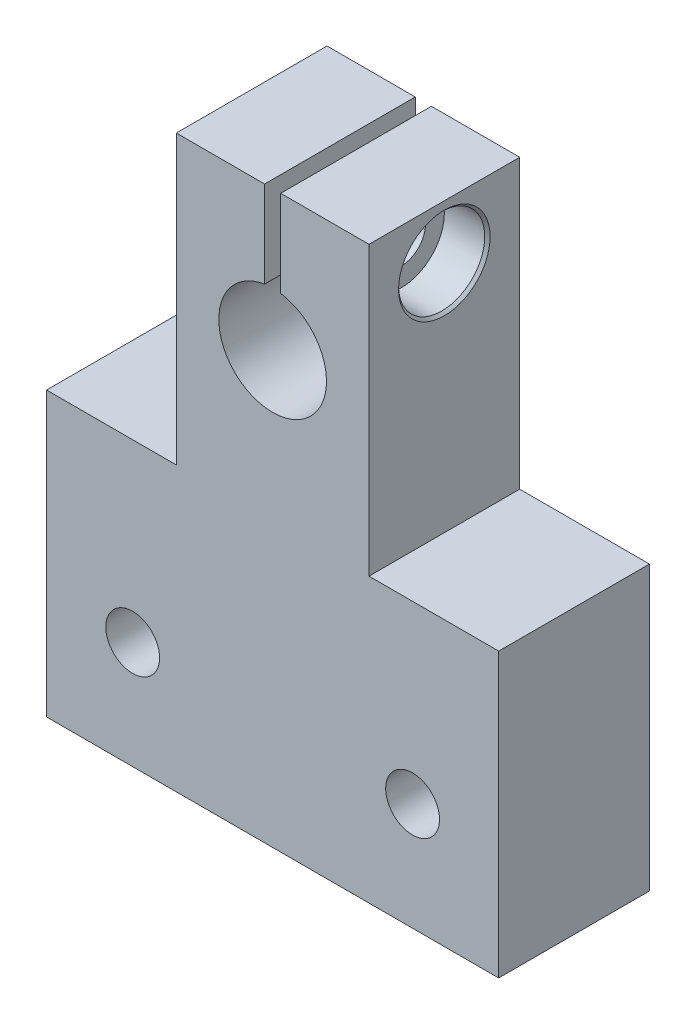
ISO-10303-21;
HEADER;
FILE_DESCRIPTION(('STEP AP214'),'2;1');
FILE_NAME('part.step','',(''),(''),'','','');
FILE_SCHEMA(('AUTOMOTIVE_DESIGN { 1 0 10303 214 1 1 1 1 }'));
ENDSEC;
DATA;
#1=APPLICATION_CONTEXT('core data for automotive mechanical design processes');
#2=APPLICATION_PROTOCOL_DEFINITION('international standard','automotive_design',2000,#1);
#3=PRODUCT_CONTEXT('',#1,'mechanical');
#4=PRODUCT('Part','Part','',(#3));
#5=PRODUCT_RELATED_PRODUCT_CATEGORY('part','',(#4));
#6=PRODUCT_DEFINITION_FORMATION('','',#4);
#7=PRODUCT_DEFINITION_CONTEXT('part definition',#1,'design');
#8=PRODUCT_DEFINITION('design','',#6,#7);
#9=PRODUCT_DEFINITION_SHAPE('','',#8);
#10=(LENGTH_UNIT() NAMED_UNIT(*) SI_UNIT(.MILLI.,.METRE.));
#11=(NAMED_UNIT(*) PLANE_ANGLE_UNIT() SI_UNIT($,.RADIAN.));
#12=(NAMED_UNIT(*) SI_UNIT($,.STERADIAN.) SOLID_ANGLE_UNIT());
#13=UNCERTAINTY_MEASURE_WITH_UNIT(LENGTH_MEASURE(1.E-05),#10,'distance_accuracy_value','');
#14=(GEOMETRIC_REPRESENTATION_CONTEXT(3) GLOBAL_UNCERTAINTY_ASSIGNED_CONTEXT((#13)) GLOBAL_UNIT_ASSIGNED_CONTEXT((#10,
#11,#12)) REPRESENTATION_CONTEXT('',''));
#15=CARTESIAN_POINT('',(0.,0.,0.));
#16=DIRECTION('',(0.,0.,1.));
#17=DIRECTION('',(1.,0.,0.));
#18=AXIS2_PLACEMENT_3D('',#15,#16,#17);
#19=CARTESIAN_POINT('',(-21.,6.3,7.));
#20=DIRECTION('',(1.,0.,0.));
#21=DIRECTION('',(0.,0.,-1.));
#22=AXIS2_PLACEMENT_3D('',#19,#20,#21);
#23=PLANE('',#22);
#24=DIRECTION('',(0.,-1.,0.));
#25=VECTOR('',#24,1.);
#26=CARTESIAN_POINT('',(-21.,6.3,-7.));
#27=LINE('',#26,#25);
#28=CARTESIAN_POINT('',(-21.,6.3,-7.));
#29=VERTEX_POINT('',#28);
#30=CARTESIAN_POINT('',(-21.,-20.,-7.));
#31=VERTEX_POINT('',#30);
#32=EDGE_CURVE('E151',#29,#31,#27,.T.);
#33=ORIENTED_EDGE('',*,*,#32,.T.);
#34=DIRECTION('',(0.,0.,-1.));
#35=VECTOR('',#34,1.);
#36=CARTESIAN_POINT('',(-21.,-20.,7.));
#37=LINE('',#36,#35);
#38=CARTESIAN_POINT('',(-21.,-20.,7.));
#39=VERTEX_POINT('',#38);
#40=EDGE_CURVE('E195',#39,#31,#37,.T.);
#41=ORIENTED_EDGE('',*,*,#40,.F.);
#42=DIRECTION('',(0.,-1.,0.));
#43=VECTOR('',#42,1.);
#44=CARTESIAN_POINT('',(-21.,6.3,7.));
#45=LINE('',#44,#43);
#46=CARTESIAN_POINT('',(-21.,6.3,7.));
#47=VERTEX_POINT('',#46);
#48=EDGE_CURVE('E172',#47,#39,#45,.T.);
#49=ORIENTED_EDGE('',*,*,#48,.F.);
#50=DIRECTION('',(0.,0.,-1.));
#51=VECTOR('',#50,1.);
#52=CARTESIAN_POINT('',(-21.,6.3,7.));
#53=LINE('',#52,#51);
#54=EDGE_CURVE('E147',#47,#29,#53,.T.);
#55=ORIENTED_EDGE('',*,*,#54,.T.);
#56=EDGE_LOOP('',(#33,#41,#49,#55));
#57=FACE_BOUND('',#56,.T.);
#58=ADVANCED_FACE('F37',(#57),#23,.F.);
#59=CARTESIAN_POINT('',(21.,6.3,7.));
#60=DIRECTION('',(-1.,0.,0.));
#61=DIRECTION('',(0.,0.,1.));
#62=AXIS2_PLACEMENT_3D('',#59,#60,#61);
#63=PLANE('',#62);
#64=DIRECTION('',(0.,1.,0.));
#65=VECTOR('',#64,1.);
#66=CARTESIAN_POINT('',(21.,6.3,-7.));
#67=LINE('',#66,#65);
#68=CARTESIAN_POINT('',(21.,-20.,-7.));
#69=VERTEX_POINT('',#68);
#70=CARTESIAN_POINT('',(21.,6.3,-7.));
#71=VERTEX_POINT('',#70);
#72=EDGE_CURVE('E154',#69,#71,#67,.T.);
#73=ORIENTED_EDGE('',*,*,#72,.T.);
#74=DIRECTION('',(0.,0.,-1.));
#75=VECTOR('',#74,1.);
#76=CARTESIAN_POINT('',(21.,6.3,7.));
#77=LINE('',#76,#75);
#78=CARTESIAN_POINT('',(21.,6.3,7.));
#79=VERTEX_POINT('',#78);
#80=EDGE_CURVE('E11',#79,#71,#77,.T.);
#81=ORIENTED_EDGE('',*,*,#80,.F.);
#82=DIRECTION('',(0.,1.,0.));
#83=VECTOR('',#82,1.);
#84=CARTESIAN_POINT('',(21.,6.3,7.));
#85=LINE('',#84,#83);
#86=CARTESIAN_POINT('',(21.,-20.,7.));
#87=VERTEX_POINT('',#86);
#88=EDGE_CURVE('E105',#87,#79,#85,.T.);
#89=ORIENTED_EDGE('',*,*,#88,.F.);
#90=DIRECTION('',(0.,0.,1.));
#91=VECTOR('',#90,1.);
#92=CARTESIAN_POINT('',(21.,-20.,-7.));
#93=LINE('',#92,#91);
#94=EDGE_CURVE('E209',#69,#87,#93,.T.);
#95=ORIENTED_EDGE('',*,*,#94,.F.);
#96=EDGE_LOOP('',(#73,#81,#89,#95));
#97=FACE_BOUND('',#96,.T.);
#98=ADVANCED_FACE('F273',(#97),#63,.F.);
#99=CARTESIAN_POINT('',(8.95,6.3,7.));
#100=DIRECTION('',(0.,-1.,0.));
#101=DIRECTION('',(0.,0.,-1.));
#102=AXIS2_PLACEMENT_3D('',#99,#100,#101);
#103=PLANE('',#102);
#104=DIRECTION('',(-1.,0.,0.));
#105=VECTOR('',#104,1.);
#106=CARTESIAN_POINT('',(8.95,6.3,-7.));
#107=LINE('',#106,#105);
#108=CARTESIAN_POINT('',(8.95,6.3,-7.));
#109=VERTEX_POINT('',#108);
#110=EDGE_CURVE('E157',#71,#109,#107,.T.);
#111=ORIENTED_EDGE('',*,*,#110,.T.);
#112=DIRECTION('',(0.,0.,-1.));
#113=VECTOR('',#112,1.);
#114=CARTESIAN_POINT('',(8.95,6.3,7.));
#115=LINE('',#114,#113);
#116=CARTESIAN_POINT('',(8.95,6.3,7.));
#117=VERTEX_POINT('',#116);
#118=EDGE_CURVE('E46',#117,#109,#115,.T.);
#119=ORIENTED_EDGE('',*,*,#118,.F.);
#120=DIRECTION('',(-1.,0.,0.));
#121=VECTOR('',#120,1.);
#122=CARTESIAN_POINT('',(8.95,6.3,7.));
#123=LINE('',#122,#121);
#124=EDGE_CURVE('E237',#79,#117,#123,.T.);
#125=ORIENTED_EDGE('',*,*,#124,.F.);
#126=ORIENTED_EDGE('',*,*,#80,.T.);
#127=EDGE_LOOP('',(#111,#119,#125,#126));
#128=FACE_BOUND('',#127,.T.);
#129=ADVANCED_FACE('F277',(#128),#103,.F.);
#130=CARTESIAN_POINT('',(8.95,33.,7.));
#131=DIRECTION('',(-1.,0.,0.));
#132=DIRECTION('',(0.,-1.,0.));
#133=AXIS2_PLACEMENT_3D('',#130,#131,#132);
#134=PLANE('',#133);
#135=CARTESIAN_POINT('',(8.95,28.,0.));
#136=DIRECTION('',(1.,0.,0.));
#137=DIRECTION('',(0.,0.,-1.));
#138=AXIS2_PLACEMENT_3D('',#135,#136,#137);
#139=CIRCLE('',#138,4.25);
#140=CARTESIAN_POINT('',(8.95,28.,-4.25));
#141=VERTEX_POINT('',#140);
#142=EDGE_CURVE('E221',#141,#141,#139,.T.);
#143=ORIENTED_EDGE('',*,*,#142,.F.);
#144=EDGE_LOOP('',(#143));
#145=FACE_BOUND('',#144,.T.);
#146=DIRECTION('',(0.,1.,0.));
#147=VECTOR('',#146,1.);
#148=CARTESIAN_POINT('',(8.95,33.,-7.));
#149=LINE('',#148,#147);
#150=CARTESIAN_POINT('',(8.95,33.,-7.));
#151=VERTEX_POINT('',#150);
#152=EDGE_CURVE('E159',#109,#151,#149,.T.);
#153=ORIENTED_EDGE('',*,*,#152,.T.);
#154=DIRECTION('',(0.,0.,-1.));
#155=VECTOR('',#154,1.);
#156=CARTESIAN_POINT('',(8.95,33.,7.));
#157=LINE('',#156,#155);
#158=CARTESIAN_POINT('',(8.95,33.,7.));
#159=VERTEX_POINT('',#158);
#160=EDGE_CURVE('E185',#159,#151,#157,.T.);
#161=ORIENTED_EDGE('',*,*,#160,.F.);
#162=DIRECTION('',(0.,1.,0.));
#163=VECTOR('',#162,1.);
#164=CARTESIAN_POINT('',(8.95,33.,7.));
#165=LINE('',#164,#163);
#166=EDGE_CURVE('E239',#117,#159,#165,.T.);
#167=ORIENTED_EDGE('',*,*,#166,.F.);
#168=ORIENTED_EDGE('',*,*,#118,.T.);
#169=EDGE_LOOP('',(#153,#161,#167,#168));
#170=FACE_BOUND('',#169,.T.);
#171=ADVANCED_FACE('F284',(#145,#170),#134,.F.);
#172=CARTESIAN_POINT('',(0.75,33.,7.));
#173=DIRECTION('',(0.,-1.,0.));
#174=DIRECTION('',(0.,0.,-1.));
#175=AXIS2_PLACEMENT_3D('',#172,#173,#174);
#176=PLANE('',#175);
#177=DIRECTION('',(-1.,0.,0.));
#178=VECTOR('',#177,1.);
#179=CARTESIAN_POINT('',(0.75,33.,-7.));
#180=LINE('',#179,#178);
#181=CARTESIAN_POINT('',(0.75,33.,-7.));
#182=VERTEX_POINT('',#181);
#183=EDGE_CURVE('E161',#151,#182,#180,.T.);
#184=ORIENTED_EDGE('',*,*,#183,.T.);
#185=DIRECTION('',(0.,0.,-1.));
#186=VECTOR('',#185,1.);
#187=CARTESIAN_POINT('',(0.75,33.,7.));
#188=LINE('',#187,#186);
#189=CARTESIAN_POINT('',(0.75,33.,7.));
#190=VERTEX_POINT('',#189);
#191=EDGE_CURVE('E182',#190,#182,#188,.T.);
#192=ORIENTED_EDGE('',*,*,#191,.F.);
#193=DIRECTION('',(-1.,0.,0.));
#194=VECTOR('',#193,1.);
#195=CARTESIAN_POINT('',(0.75,33.,7.));
#196=LINE('',#195,#194);
#197=EDGE_CURVE('E241',#159,#190,#196,.T.);
#198=ORIENTED_EDGE('',*,*,#197,.F.);
#199=ORIENTED_EDGE('',*,*,#160,.T.);
#200=EDGE_LOOP('',(#184,#192,#198,#199));
#201=FACE_BOUND('',#200,.T.);
#202=ADVANCED_FACE('F288',(#201),#176,.F.);
#203=CARTESIAN_POINT('',(0.75,33.,7.));
#204=DIRECTION('',(1.,0.,0.));
#205=DIRECTION('',(0.,1.,0.));
#206=AXIS2_PLACEMENT_3D('',#203,#204,#205);
#207=PLANE('',#206);
#208=CARTESIAN_POINT('',(0.750000000000001,28.,0.));
#209=DIRECTION('',(1.,0.,0.));
#210=DIRECTION('',(0.,1.,0.));
#211=AXIS2_PLACEMENT_3D('',#208,#209,#210);
#212=CIRCLE('',#211,2.25);
#213=CARTESIAN_POINT('',(0.75,30.25,0.));
#214=VERTEX_POINT('',#213);
#215=EDGE_CURVE('E155',#214,#214,#212,.T.);
#216=ORIENTED_EDGE('',*,*,#215,.T.);
#217=EDGE_LOOP('',(#216));
#218=FACE_BOUND('',#217,.T.);
#219=DIRECTION('',(0.,-1.,0.));
#220=VECTOR('',#219,1.);
#221=CARTESIAN_POINT('',(0.75,33.,-7.));
#222=LINE('',#221,#220);
#223=CARTESIAN_POINT('',(0.750000000000002,24.9434299833213,-7.));
#224=VERTEX_POINT('',#223);
#225=EDGE_CURVE('E163',#182,#224,#222,.T.);
#226=ORIENTED_EDGE('',*,*,#225,.T.);
#227=DIRECTION('',(0.,0.,-1.));
#228=VECTOR('',#227,1.);
#229=CARTESIAN_POINT('',(0.750000000000002,24.9434299833213,7.));
#230=LINE('',#229,#228);
#231=CARTESIAN_POINT('',(0.750000000000002,24.9434299833213,7.));
#232=VERTEX_POINT('',#231);
#233=EDGE_CURVE('E179',#232,#224,#230,.T.);
#234=ORIENTED_EDGE('',*,*,#233,.F.);
#235=DIRECTION('',(0.,-1.,0.));
#236=VECTOR('',#235,1.);
#237=CARTESIAN_POINT('',(0.75,33.,7.));
#238=LINE('',#237,#236);
#239=EDGE_CURVE('E243',#190,#232,#238,.T.);
#240=ORIENTED_EDGE('',*,*,#239,.F.);
#241=ORIENTED_EDGE('',*,*,#191,.T.);
#242=EDGE_LOOP('',(#226,#234,#240,#241));
#243=FACE_BOUND('',#242,.T.);
#244=ADVANCED_FACE('F291',(#218,#243),#207,.F.);
#245=CARTESIAN_POINT('',(0.,20.,7.));
#246=DIRECTION('',(0.,0.,-1.));
#247=DIRECTION('',(-1.,0.,0.));
#248=AXIS2_PLACEMENT_3D('',#245,#246,#247);
#249=CYLINDRICAL_SURFACE('',#248,5.);
#250=CARTESIAN_POINT('',(0.,20.,-7.));
#251=DIRECTION('',(0.,0.,-1.));
#252=DIRECTION('',(1.,0.,0.));
#253=AXIS2_PLACEMENT_3D('',#250,#251,#252);
#254=CIRCLE('',#253,5.);
#255=CARTESIAN_POINT('',(-0.750000000000001,24.9434299833213,-7.));
#256=VERTEX_POINT('',#255);
#257=EDGE_CURVE('E165',#224,#256,#254,.T.);
#258=ORIENTED_EDGE('',*,*,#257,.T.);
#259=DIRECTION('',(0.,0.,-1.));
#260=VECTOR('',#259,1.);
#261=CARTESIAN_POINT('',(-0.750000000000001,24.9434299833213,7.));
#262=LINE('',#261,#260);
#263=CARTESIAN_POINT('',(-0.750000000000001,24.9434299833213,7.));
#264=VERTEX_POINT('',#263);
#265=EDGE_CURVE('E176',#264,#256,#262,.T.);
#266=ORIENTED_EDGE('',*,*,#265,.F.);
#267=CARTESIAN_POINT('',(0.,20.,7.));
#268=DIRECTION('',(0.,0.,-1.));
#269=DIRECTION('',(1.,0.,0.));
#270=AXIS2_PLACEMENT_3D('',#267,#268,#269);
#271=CIRCLE('',#270,5.);
#272=EDGE_CURVE('E245',#232,#264,#271,.T.);
#273=ORIENTED_EDGE('',*,*,#272,.F.);
#274=ORIENTED_EDGE('',*,*,#233,.T.);
#275=EDGE_LOOP('',(#258,#266,#273,#274));
#276=FACE_BOUND('',#275,.T.);
#277=ADVANCED_FACE('F251',(#276),#249,.F.);
#278=CARTESIAN_POINT('',(-0.75,33.,7.));
#279=DIRECTION('',(-1.,0.,0.));
#280=DIRECTION('',(0.,-1.,0.));
#281=AXIS2_PLACEMENT_3D('',#278,#279,#280);
#282=PLANE('',#281);
#283=CARTESIAN_POINT('',(-0.75,28.,0.));
#284=DIRECTION('',(1.,0.,0.));
#285=DIRECTION('',(0.,0.,-1.));
#286=AXIS2_PLACEMENT_3D('',#283,#284,#285);
#287=CIRCLE('',#286,1.65);
#288=CARTESIAN_POINT('',(-0.75,28.,-1.65));
#289=VERTEX_POINT('',#288);
#290=EDGE_CURVE('E215',#289,#289,#287,.T.);
#291=ORIENTED_EDGE('',*,*,#290,.F.);
#292=EDGE_LOOP('',(#291));
#293=FACE_BOUND('',#292,.T.);
#294=DIRECTION('',(0.,1.,0.));
#295=VECTOR('',#294,1.);
#296=CARTESIAN_POINT('',(-0.75,33.,-7.));
#297=LINE('',#296,#295);
#298=CARTESIAN_POINT('',(-0.75,33.,-7.));
#299=VERTEX_POINT('',#298);
#300=EDGE_CURVE('E167',#256,#299,#297,.T.);
#301=ORIENTED_EDGE('',*,*,#300,.T.);
#302=DIRECTION('',(0.,0.,-1.));
#303=VECTOR('',#302,1.);
#304=CARTESIAN_POINT('',(-0.75,33.,7.));
#305=LINE('',#304,#303);
#306=CARTESIAN_POINT('',(-0.75,33.,7.));
#307=VERTEX_POINT('',#306);
#308=EDGE_CURVE('E142',#307,#299,#305,.T.);
#309=ORIENTED_EDGE('',*,*,#308,.F.);
#310=DIRECTION('',(0.,1.,0.));
#311=VECTOR('',#310,1.);
#312=CARTESIAN_POINT('',(-0.75,33.,7.));
#313=LINE('',#312,#311);
#314=EDGE_CURVE('E133',#264,#307,#313,.T.);
#315=ORIENTED_EDGE('',*,*,#314,.F.);
#316=ORIENTED_EDGE('',*,*,#265,.T.);
#317=EDGE_LOOP('',(#301,#309,#315,#316));
#318=FACE_BOUND('',#317,.T.);
#319=ADVANCED_FACE('F255',(#293,#318),#282,.F.);
#320=CARTESIAN_POINT('',(-8.95,33.,7.));
#321=DIRECTION('',(0.,-1.,0.));
#322=DIRECTION('',(0.,0.,-1.));
#323=AXIS2_PLACEMENT_3D('',#320,#321,#322);
#324=PLANE('',#323);
#325=DIRECTION('',(-1.,0.,0.));
#326=VECTOR('',#325,1.);
#327=CARTESIAN_POINT('',(-8.95,33.,-7.));
#328=LINE('',#327,#326);
#329=CARTESIAN_POINT('',(-8.95,33.,-7.));
#330=VERTEX_POINT('',#329);
#331=EDGE_CURVE('E141',#299,#330,#328,.T.);
#332=ORIENTED_EDGE('',*,*,#331,.T.);
#333=DIRECTION('',(0.,0.,-1.));
#334=VECTOR('',#333,1.);
#335=CARTESIAN_POINT('',(-8.95,33.,7.));
#336=LINE('',#335,#334);
#337=CARTESIAN_POINT('',(-8.95,33.,7.));
#338=VERTEX_POINT('',#337);
#339=EDGE_CURVE('E138',#338,#330,#336,.T.);
#340=ORIENTED_EDGE('',*,*,#339,.F.);
#341=DIRECTION('',(-1.,0.,0.));
#342=VECTOR('',#341,1.);
#343=CARTESIAN_POINT('',(-8.95,33.,7.));
#344=LINE('',#343,#342);
#345=EDGE_CURVE('E127',#307,#338,#344,.T.);
#346=ORIENTED_EDGE('',*,*,#345,.F.);
#347=ORIENTED_EDGE('',*,*,#308,.T.);
#348=EDGE_LOOP('',(#332,#340,#346,#347));
#349=FACE_BOUND('',#348,.T.);
#350=ADVANCED_FACE('F139',(#349),#324,.F.);
#351=CARTESIAN_POINT('',(-8.95,33.,7.));
#352=DIRECTION('',(1.,0.,0.));
#353=DIRECTION('',(0.,1.,0.));
#354=AXIS2_PLACEMENT_3D('',#351,#352,#353);
#355=PLANE('',#354);
#356=CARTESIAN_POINT('',(-8.95,28.,0.));
#357=DIRECTION('',(1.,0.,0.));
#358=DIRECTION('',(0.,1.,0.));
#359=AXIS2_PLACEMENT_3D('',#356,#357,#358);
#360=CIRCLE('',#359,1.65);
#361=CARTESIAN_POINT('',(-8.95,29.65,0.));
#362=VERTEX_POINT('',#361);
#363=EDGE_CURVE('E218',#362,#362,#360,.T.);
#364=ORIENTED_EDGE('',*,*,#363,.T.);
#365=EDGE_LOOP('',(#364));
#366=FACE_BOUND('',#365,.T.);
#367=DIRECTION('',(0.,-1.,0.));
#368=VECTOR('',#367,1.);
#369=CARTESIAN_POINT('',(-8.95,33.,-7.));
#370=LINE('',#369,#368);
#371=CARTESIAN_POINT('',(-8.95,6.3,-7.));
#372=VERTEX_POINT('',#371);
#373=EDGE_CURVE('E91',#330,#372,#370,.T.);
#374=ORIENTED_EDGE('',*,*,#373,.T.);
#375=DIRECTION('',(0.,0.,-1.));
#376=VECTOR('',#375,1.);
#377=CARTESIAN_POINT('',(-8.95,6.3,7.));
#378=LINE('',#377,#376);
#379=CARTESIAN_POINT('',(-8.95,6.3,7.));
#380=VERTEX_POINT('',#379);
#381=EDGE_CURVE('E143',#380,#372,#378,.T.);
#382=ORIENTED_EDGE('',*,*,#381,.F.);
#383=DIRECTION('',(0.,-1.,0.));
#384=VECTOR('',#383,1.);
#385=CARTESIAN_POINT('',(-8.95,33.,7.));
#386=LINE('',#385,#384);
#387=EDGE_CURVE('E131',#338,#380,#386,.T.);
#388=ORIENTED_EDGE('',*,*,#387,.F.);
#389=ORIENTED_EDGE('',*,*,#339,.T.);
#390=EDGE_LOOP('',(#374,#382,#388,#389));
#391=FACE_BOUND('',#390,.T.);
#392=ADVANCED_FACE('F145',(#366,#391),#355,.F.);
#393=CARTESIAN_POINT('',(-21.,6.3,7.));
#394=DIRECTION('',(0.,-1.,0.));
#395=DIRECTION('',(0.,0.,-1.));
#396=AXIS2_PLACEMENT_3D('',#393,#394,#395);
#397=PLANE('',#396);
#398=DIRECTION('',(-1.,0.,0.));
#399=VECTOR('',#398,1.);
#400=CARTESIAN_POINT('',(-21.,6.3,-7.));
#401=LINE('',#400,#399);
#402=EDGE_CURVE('E97',#372,#29,#401,.T.);
#403=ORIENTED_EDGE('',*,*,#402,.T.);
#404=ORIENTED_EDGE('',*,*,#54,.F.);
#405=DIRECTION('',(-1.,0.,0.));
#406=VECTOR('',#405,1.);
#407=CARTESIAN_POINT('',(-21.,6.3,7.));
#408=LINE('',#407,#406);
#409=EDGE_CURVE('E55',#380,#47,#408,.T.);
#410=ORIENTED_EDGE('',*,*,#409,.F.);
#411=ORIENTED_EDGE('',*,*,#381,.T.);
#412=EDGE_LOOP('',(#403,#404,#410,#411));
#413=FACE_BOUND('',#412,.T.);
#414=ADVANCED_FACE('F343',(#413),#397,.F.);
#415=CARTESIAN_POINT('',(0.,20.,7.));
#416=DIRECTION('',(0.,0.,1.));
#417=DIRECTION('',(1.,0.,0.));
#418=AXIS2_PLACEMENT_3D('',#415,#416,#417);
#419=PLANE('',#418);
#420=CARTESIAN_POINT('',(-13.,-10.0000000000039,7.));
#421=DIRECTION('',(0.,0.,1.));
#422=DIRECTION('',(1.,0.,0.));
#423=AXIS2_PLACEMENT_3D('',#420,#421,#422);
#424=CIRCLE('',#423,2.5);
#425=CARTESIAN_POINT('',(-10.5,-10.0000000000039,7.));
#426=VERTEX_POINT('',#425);
#427=EDGE_CURVE('E191',#426,#426,#424,.T.);
#428=ORIENTED_EDGE('',*,*,#427,.F.);
#429=EDGE_LOOP('',(#428));
#430=FACE_BOUND('',#429,.T.);
#431=CARTESIAN_POINT('',(13.,-10.0000000000039,7.));
#432=DIRECTION('',(0.,0.,1.));
#433=DIRECTION('',(1.,0.,0.));
#434=AXIS2_PLACEMENT_3D('',#431,#432,#433);
#435=CIRCLE('',#434,2.5);
#436=CARTESIAN_POINT('',(15.5,-10.0000000000039,7.));
#437=VERTEX_POINT('',#436);
#438=EDGE_CURVE('E197',#437,#437,#435,.T.);
#439=ORIENTED_EDGE('',*,*,#438,.F.);
#440=EDGE_LOOP('',(#439));
#441=FACE_BOUND('',#440,.T.);
#442=ORIENTED_EDGE('',*,*,#48,.T.);
#443=DIRECTION('',(-1.,0.,0.));
#444=VECTOR('',#443,1.);
#445=CARTESIAN_POINT('',(21.,-20.,7.));
#446=LINE('',#445,#444);
#447=EDGE_CURVE('E212',#87,#39,#446,.T.);
#448=ORIENTED_EDGE('',*,*,#447,.F.);
#449=ORIENTED_EDGE('',*,*,#88,.T.);
#450=ORIENTED_EDGE('',*,*,#124,.T.);
#451=ORIENTED_EDGE('',*,*,#166,.T.);
#452=ORIENTED_EDGE('',*,*,#197,.T.);
#453=ORIENTED_EDGE('',*,*,#239,.T.);
#454=ORIENTED_EDGE('',*,*,#272,.T.);
#455=ORIENTED_EDGE('',*,*,#314,.T.);
#456=ORIENTED_EDGE('',*,*,#345,.T.);
#457=ORIENTED_EDGE('',*,*,#387,.T.);
#458=ORIENTED_EDGE('',*,*,#409,.T.);
#459=EDGE_LOOP('',(#442,#448,#449,#450,#451,#452,#453,#454,#455,#456,#457,#458));
#460=FACE_BOUND('',#459,.T.);
#461=ADVANCED_FACE('F129',(#430,#441,#460),#419,.T.);
#462=CARTESIAN_POINT('',(0.,20.,-7.));
#463=DIRECTION('',(0.,0.,1.));
#464=DIRECTION('',(1.,0.,0.));
#465=AXIS2_PLACEMENT_3D('',#462,#463,#464);
#466=PLANE('',#465);
#467=CARTESIAN_POINT('',(-13.,-10.0000000000039,-7.));
#468=DIRECTION('',(0.,0.,1.));
#469=DIRECTION('',(1.,0.,0.));
#470=AXIS2_PLACEMENT_3D('',#467,#468,#469);
#471=CIRCLE('',#470,2.5);
#472=CARTESIAN_POINT('',(-10.5,-10.0000000000039,-7.));
#473=VERTEX_POINT('',#472);
#474=EDGE_CURVE('E40',#473,#473,#471,.T.);
#475=ORIENTED_EDGE('',*,*,#474,.T.);
#476=EDGE_LOOP('',(#475));
#477=FACE_BOUND('',#476,.T.);
#478=CARTESIAN_POINT('',(13.,-10.0000000000039,-7.));
#479=DIRECTION('',(0.,0.,1.));
#480=DIRECTION('',(1.,0.,0.));
#481=AXIS2_PLACEMENT_3D('',#478,#479,#480);
#482=CIRCLE('',#481,2.5);
#483=CARTESIAN_POINT('',(15.5,-10.0000000000039,-7.));
#484=VERTEX_POINT('',#483);
#485=EDGE_CURVE('E189',#484,#484,#482,.T.);
#486=ORIENTED_EDGE('',*,*,#485,.T.);
#487=EDGE_LOOP('',(#486));
#488=FACE_BOUND('',#487,.T.);
#489=ORIENTED_EDGE('',*,*,#32,.F.);
#490=ORIENTED_EDGE('',*,*,#402,.F.);
#491=ORIENTED_EDGE('',*,*,#373,.F.);
#492=ORIENTED_EDGE('',*,*,#331,.F.);
#493=ORIENTED_EDGE('',*,*,#300,.F.);
#494=ORIENTED_EDGE('',*,*,#257,.F.);
#495=ORIENTED_EDGE('',*,*,#225,.F.);
#496=ORIENTED_EDGE('',*,*,#183,.F.);
#497=ORIENTED_EDGE('',*,*,#152,.F.);
#498=ORIENTED_EDGE('',*,*,#110,.F.);
#499=ORIENTED_EDGE('',*,*,#72,.F.);
#500=DIRECTION('',(1.,0.,0.));
#501=VECTOR('',#500,1.);
#502=CARTESIAN_POINT('',(-21.,-20.,-7.));
#503=LINE('',#502,#501);
#504=EDGE_CURVE('E206',#31,#69,#503,.T.);
#505=ORIENTED_EDGE('',*,*,#504,.F.);
#506=EDGE_LOOP('',(#489,#490,#491,#492,#493,#494,#495,#496,#497,#498,#499,#505));
#507=FACE_BOUND('',#506,.T.);
#508=ADVANCED_FACE('F258',(#477,#488,#507),#466,.F.);
#509=CARTESIAN_POINT('',(8.95,28.,0.));
#510=DIRECTION('',(1.,0.,0.));
#511=DIRECTION('',(0.,0.,-1.));
#512=AXIS2_PLACEMENT_3D('',#509,#510,#511);
#513=CYLINDRICAL_SURFACE('',#512,2.25);
#514=ORIENTED_EDGE('',*,*,#215,.F.);
#515=EDGE_LOOP('',(#514));
#516=FACE_BOUND('',#515,.T.);
#517=CARTESIAN_POINT('',(4.95,28.,0.));
#518=DIRECTION('',(1.,0.,0.));
#519=DIRECTION('',(0.,0.,-1.));
#520=AXIS2_PLACEMENT_3D('',#517,#518,#519);
#521=CIRCLE('',#520,2.25);
#522=CARTESIAN_POINT('',(4.95,28.,-2.25));
#523=VERTEX_POINT('',#522);
#524=EDGE_CURVE('E230',#523,#523,#521,.T.);
#525=ORIENTED_EDGE('',*,*,#524,.T.);
#526=EDGE_LOOP('',(#525));
#527=FACE_BOUND('',#526,.T.);
#528=ADVANCED_FACE('F336',(#516,#527),#513,.F.);
#529=CARTESIAN_POINT('',(4.95,32.,0.));
#530=DIRECTION('',(-1.,0.,0.));
#531=DIRECTION('',(0.,0.,1.));
#532=AXIS2_PLACEMENT_3D('',#529,#530,#531);
#533=PLANE('',#532);
#534=ORIENTED_EDGE('',*,*,#524,.F.);
#535=EDGE_LOOP('',(#534));
#536=FACE_BOUND('',#535,.T.);
#537=CARTESIAN_POINT('',(4.95,28.,0.));
#538=DIRECTION('',(1.,0.,0.));
#539=DIRECTION('',(0.,0.,-1.));
#540=AXIS2_PLACEMENT_3D('',#537,#538,#539);
#541=CIRCLE('',#540,4.);
#542=CARTESIAN_POINT('',(4.95,28.,-4.));
#543=VERTEX_POINT('',#542);
#544=EDGE_CURVE('E227',#543,#543,#541,.T.);
#545=ORIENTED_EDGE('',*,*,#544,.T.);
#546=EDGE_LOOP('',(#545));
#547=FACE_BOUND('',#546,.T.);
#548=ADVANCED_FACE('F328',(#536,#547),#533,.F.);
#549=CARTESIAN_POINT('',(8.95,28.,0.));
#550=DIRECTION('',(1.,0.,0.));
#551=DIRECTION('',(0.,0.,-1.));
#552=AXIS2_PLACEMENT_3D('',#549,#550,#551);
#553=CYLINDRICAL_SURFACE('',#552,4.);
#554=ORIENTED_EDGE('',*,*,#544,.F.);
#555=EDGE_LOOP('',(#554));
#556=FACE_BOUND('',#555,.T.);
#557=CARTESIAN_POINT('',(8.7,28.,0.));
#558=DIRECTION('',(1.,0.,0.));
#559=DIRECTION('',(0.,0.,-1.));
#560=AXIS2_PLACEMENT_3D('',#557,#558,#559);
#561=CIRCLE('',#560,4.);
#562=CARTESIAN_POINT('',(8.7,28.,-4.));
#563=VERTEX_POINT('',#562);
#564=EDGE_CURVE('E224',#563,#563,#561,.T.);
#565=ORIENTED_EDGE('',*,*,#564,.T.);
#566=EDGE_LOOP('',(#565));
#567=FACE_BOUND('',#566,.T.);
#568=ADVANCED_FACE('F319',(#556,#567),#553,.F.);
#569=CARTESIAN_POINT('',(8.95,28.,0.));
#570=DIRECTION('',(1.,0.,0.));
#571=DIRECTION('',(0.,0.,-1.));
#572=AXIS2_PLACEMENT_3D('',#569,#570,#571);
#573=CONICAL_SURFACE('',#572,4.25,0.785398163397442);
#574=ORIENTED_EDGE('',*,*,#564,.F.);
#575=EDGE_LOOP('',(#574));
#576=FACE_BOUND('',#575,.T.);
#577=ORIENTED_EDGE('',*,*,#142,.T.);
#578=EDGE_LOOP('',(#577));
#579=FACE_BOUND('',#578,.T.);
#580=ADVANCED_FACE('F316',(#576,#579),#573,.F.);
#581=CARTESIAN_POINT('',(-0.75,28.,0.));
#582=DIRECTION('',(1.,0.,0.));
#583=DIRECTION('',(0.,0.,-1.));
#584=AXIS2_PLACEMENT_3D('',#581,#582,#583);
#585=CYLINDRICAL_SURFACE('',#584,1.65);
#586=ORIENTED_EDGE('',*,*,#363,.F.);
#587=EDGE_LOOP('',(#586));
#588=FACE_BOUND('',#587,.T.);
#589=ORIENTED_EDGE('',*,*,#290,.T.);
#590=EDGE_LOOP('',(#589));
#591=FACE_BOUND('',#590,.T.);
#592=ADVANCED_FACE('F318',(#588,#591),#585,.F.);
#593=CARTESIAN_POINT('',(0.,-20.,0.));
#594=DIRECTION('',(0.,-1.,0.));
#595=DIRECTION('',(0.,0.,-1.));
#596=AXIS2_PLACEMENT_3D('',#593,#594,#595);
#597=PLANE('',#596);
#598=ORIENTED_EDGE('',*,*,#40,.T.);
#599=ORIENTED_EDGE('',*,*,#504,.T.);
#600=ORIENTED_EDGE('',*,*,#94,.T.);
#601=ORIENTED_EDGE('',*,*,#447,.T.);
#602=EDGE_LOOP('',(#598,#599,#600,#601));
#603=FACE_BOUND('',#602,.T.);
#604=ADVANCED_FACE('F272',(#603),#597,.T.);
#605=CARTESIAN_POINT('',(13.,-10.0000000000039,-21.));
#606=DIRECTION('',(0.,0.,1.));
#607=DIRECTION('',(1.,0.,0.));
#608=AXIS2_PLACEMENT_3D('',#605,#606,#607);
#609=CYLINDRICAL_SURFACE('',#608,2.5);
#610=CARTESIAN_POINT('',(15.5,-10.0000000000039,7.));
#611=CARTESIAN_POINT('',(15.5,-10.0000000000039,6.85416666666667));
#612=CARTESIAN_POINT('',(15.5,-10.0000000000039,6.70833333333334));
#613=CARTESIAN_POINT('',(15.5,-10.0000000000039,6.41666666666667));
#614=CARTESIAN_POINT('',(15.5,-10.0000000000039,6.27083333333334));
#615=CARTESIAN_POINT('',(15.5,-10.0000000000039,5.97916666666667));
#616=CARTESIAN_POINT('',(15.5,-10.0000000000039,5.83333333333334));
#617=CARTESIAN_POINT('',(15.5,-10.0000000000039,5.54166666666667));
#618=CARTESIAN_POINT('',(15.5,-10.0000000000039,5.39583333333333));
#619=CARTESIAN_POINT('',(15.5,-10.0000000000039,5.10416666666667));
#620=CARTESIAN_POINT('',(15.5,-10.0000000000039,4.95833333333333));
#621=CARTESIAN_POINT('',(15.5,-10.0000000000039,4.66666666666667));
#622=CARTESIAN_POINT('',(15.5,-10.0000000000039,4.52083333333333));
#623=CARTESIAN_POINT('',(15.5,-10.0000000000039,4.22916666666667));
#624=CARTESIAN_POINT('',(15.5,-10.0000000000039,4.08333333333333));
#625=CARTESIAN_POINT('',(15.5,-10.0000000000039,3.79166666666667));
#626=CARTESIAN_POINT('',(15.5,-10.0000000000039,3.64583333333333));
#627=CARTESIAN_POINT('',(15.5,-10.0000000000039,3.35416666666667));
#628=CARTESIAN_POINT('',(15.5,-10.0000000000039,3.20833333333333));
#629=CARTESIAN_POINT('',(15.5,-10.0000000000039,2.91666666666667));
#630=CARTESIAN_POINT('',(15.5,-10.0000000000039,2.77083333333333));
#631=CARTESIAN_POINT('',(15.5,-10.0000000000039,2.47916666666667));
#632=CARTESIAN_POINT('',(15.5,-10.0000000000039,2.33333333333333));
#633=CARTESIAN_POINT('',(15.5,-10.0000000000039,2.04166666666667));
#634=CARTESIAN_POINT('',(15.5,-10.0000000000039,1.89583333333333));
#635=CARTESIAN_POINT('',(15.5,-10.0000000000039,1.60416666666667));
#636=CARTESIAN_POINT('',(15.5,-10.0000000000039,1.45833333333333));
#637=CARTESIAN_POINT('',(15.5,-10.0000000000039,1.16666666666667));
#638=CARTESIAN_POINT('',(15.5,-10.0000000000039,1.02083333333333));
#639=CARTESIAN_POINT('',(15.5,-10.0000000000039,0.729166666666667));
#640=CARTESIAN_POINT('',(15.5,-10.0000000000039,0.583333333333334));
#641=CARTESIAN_POINT('',(15.5,-10.0000000000039,0.291666666666667));
#642=CARTESIAN_POINT('',(15.5,-10.0000000000039,0.145833333333333));
#643=CARTESIAN_POINT('',(15.5,-10.0000000000039,-0.145833333333333));
#644=CARTESIAN_POINT('',(15.5,-10.0000000000039,-0.291666666666667));
#645=CARTESIAN_POINT('',(15.5,-10.0000000000039,-0.583333333333334));
#646=CARTESIAN_POINT('',(15.5,-10.0000000000039,-0.729166666666667));
#647=CARTESIAN_POINT('',(15.5,-10.0000000000039,-1.02083333333333));
#648=CARTESIAN_POINT('',(15.5,-10.0000000000039,-1.16666666666667));
#649=CARTESIAN_POINT('',(15.5,-10.0000000000039,-1.45833333333333));
#650=CARTESIAN_POINT('',(15.5,-10.0000000000039,-1.60416666666667));
#651=CARTESIAN_POINT('',(15.5,-10.0000000000039,-1.89583333333333));
#652=CARTESIAN_POINT('',(15.5,-10.0000000000039,-2.04166666666667));
#653=CARTESIAN_POINT('',(15.5,-10.0000000000039,-2.33333333333333));
#654=CARTESIAN_POINT('',(15.5,-10.0000000000039,-2.47916666666667));
#655=CARTESIAN_POINT('',(15.5,-10.0000000000039,-2.77083333333333));
#656=CARTESIAN_POINT('',(15.5,-10.0000000000039,-2.91666666666667));
#657=CARTESIAN_POINT('',(15.5,-10.0000000000039,-3.20833333333333));
#658=CARTESIAN_POINT('',(15.5,-10.0000000000039,-3.35416666666667));
#659=CARTESIAN_POINT('',(15.5,-10.0000000000039,-3.64583333333333));
#660=CARTESIAN_POINT('',(15.5,-10.0000000000039,-3.79166666666667));
#661=CARTESIAN_POINT('',(15.5,-10.0000000000039,-4.08333333333333));
#662=CARTESIAN_POINT('',(15.5,-10.0000000000039,-4.22916666666667));
#663=CARTESIAN_POINT('',(15.5,-10.0000000000039,-4.52083333333333));
#664=CARTESIAN_POINT('',(15.5,-10.0000000000039,-4.66666666666667));
#665=CARTESIAN_POINT('',(15.5,-10.0000000000039,-4.95833333333333));
#666=CARTESIAN_POINT('',(15.5,-10.0000000000039,-5.10416666666667));
#667=CARTESIAN_POINT('',(15.5,-10.0000000000039,-5.39583333333333));
#668=CARTESIAN_POINT('',(15.5,-10.0000000000039,-5.54166666666667));
#669=CARTESIAN_POINT('',(15.5,-10.0000000000039,-5.83333333333333));
#670=CARTESIAN_POINT('',(15.5,-10.0000000000039,-5.97916666666667));
#671=CARTESIAN_POINT('',(15.5,-10.0000000000039,-6.27083333333333));
#672=CARTESIAN_POINT('',(15.5,-10.0000000000039,-6.41666666666667));
#673=CARTESIAN_POINT('',(15.5,-10.0000000000039,-6.70833333333333));
#674=CARTESIAN_POINT('',(15.5,-10.0000000000039,-6.85416666666667));
#675=CARTESIAN_POINT('',(15.5,-10.0000000000039,-7.));
#676=B_SPLINE_CURVE_WITH_KNOTS('',3,(#610,#611,#612,#613,#614,#615,#616,#617,#618,#619,#620,
#621,#622,#623,#624,#625,#626,#627,#628,#629,#630,#631,#632,#633,#634,#635,#636,#637,#638,#639,
#640,#641,#642,#643,#644,#645,#646,#647,#648,#649,#650,#651,#652,#653,#654,#655,#656,#657,#658,
#659,#660,#661,#662,#663,#664,#665,#666,#667,#668,#669,#670,#671,#672,#673,#674,#675),
.UNSPECIFIED.,.F.,.F.,(4,2,2,2,2,2,2,2,2,2,2,2,2,2,2,2,2,2,2,2,2,2,2,2,2,2,2,2,2,2,2,2,4),(0.,
0.4375,0.875000000000001,1.3125,1.75,2.1875,2.625,3.0625,3.5,3.9375,4.375,4.8125,5.25,5.6875,
6.125,6.5625,7.,7.4375,7.875,8.3125,8.75,9.1875,9.625,10.0625,10.5,10.9375,11.375,11.8125,12.25,
12.6875,13.125,13.5625,14.),.UNSPECIFIED.);
#677=EDGE_CURVE('BSEAM490',#437,#484,#676,.T.);
#678=ORIENTED_EDGE('',*,*,#438,.T.);
#679=ORIENTED_EDGE('',*,*,#485,.F.);
#680=ORIENTED_EDGE('',*,*,#677,.T.);
#681=ORIENTED_EDGE('',*,*,#677,.F.);
#682=EDGE_LOOP('',(#678,#680,#679,#681));
#683=FACE_BOUND('',#682,.T.);
#684=ADVANCED_FACE('F490',(#683),#609,.F.);
#685=CARTESIAN_POINT('',(-13.,-10.0000000000039,-21.));
#686=DIRECTION('',(0.,0.,1.));
#687=DIRECTION('',(1.,0.,0.));
#688=AXIS2_PLACEMENT_3D('',#685,#686,#687);
#689=CYLINDRICAL_SURFACE('',#688,2.5);
#690=CARTESIAN_POINT('',(-10.5,-10.0000000000039,7.));
#691=CARTESIAN_POINT('',(-10.5,-10.0000000000039,6.85416666666667));
#692=CARTESIAN_POINT('',(-10.5,-10.0000000000039,6.70833333333334));
#693=CARTESIAN_POINT('',(-10.5,-10.0000000000039,6.41666666666667));
#694=CARTESIAN_POINT('',(-10.5,-10.0000000000039,6.27083333333334));
#695=CARTESIAN_POINT('',(-10.5,-10.0000000000039,5.97916666666667));
#696=CARTESIAN_POINT('',(-10.5,-10.0000000000039,5.83333333333334));
#697=CARTESIAN_POINT('',(-10.5,-10.0000000000039,5.54166666666667));
#698=CARTESIAN_POINT('',(-10.5,-10.0000000000039,5.39583333333333));
#699=CARTESIAN_POINT('',(-10.5,-10.0000000000039,5.10416666666667));
#700=CARTESIAN_POINT('',(-10.5,-10.0000000000039,4.95833333333333));
#701=CARTESIAN_POINT('',(-10.5,-10.0000000000039,4.66666666666667));
#702=CARTESIAN_POINT('',(-10.5,-10.0000000000039,4.52083333333333));
#703=CARTESIAN_POINT('',(-10.5,-10.0000000000039,4.22916666666667));
#704=CARTESIAN_POINT('',(-10.5,-10.0000000000039,4.08333333333333));
#705=CARTESIAN_POINT('',(-10.5,-10.0000000000039,3.79166666666667));
#706=CARTESIAN_POINT('',(-10.5,-10.0000000000039,3.64583333333333));
#707=CARTESIAN_POINT('',(-10.5,-10.0000000000039,3.35416666666667));
#708=CARTESIAN_POINT('',(-10.5,-10.0000000000039,3.20833333333333));
#709=CARTESIAN_POINT('',(-10.5,-10.0000000000039,2.91666666666667));
#710=CARTESIAN_POINT('',(-10.5,-10.0000000000039,2.77083333333333));
#711=CARTESIAN_POINT('',(-10.5,-10.0000000000039,2.47916666666667));
#712=CARTESIAN_POINT('',(-10.5,-10.0000000000039,2.33333333333333));
#713=CARTESIAN_POINT('',(-10.5,-10.0000000000039,2.04166666666667));
#714=CARTESIAN_POINT('',(-10.5,-10.0000000000039,1.89583333333333));
#715=CARTESIAN_POINT('',(-10.5,-10.0000000000039,1.60416666666667));
#716=CARTESIAN_POINT('',(-10.5,-10.0000000000039,1.45833333333333));
#717=CARTESIAN_POINT('',(-10.5,-10.0000000000039,1.16666666666667));
#718=CARTESIAN_POINT('',(-10.5,-10.0000000000039,1.02083333333333));
#719=CARTESIAN_POINT('',(-10.5,-10.0000000000039,0.729166666666667));
#720=CARTESIAN_POINT('',(-10.5,-10.0000000000039,0.583333333333334));
#721=CARTESIAN_POINT('',(-10.5,-10.0000000000039,0.291666666666667));
#722=CARTESIAN_POINT('',(-10.5,-10.0000000000039,0.145833333333333));
#723=CARTESIAN_POINT('',(-10.5,-10.0000000000039,-0.145833333333333));
#724=CARTESIAN_POINT('',(-10.5,-10.0000000000039,-0.291666666666667));
#725=CARTESIAN_POINT('',(-10.5,-10.0000000000039,-0.583333333333334));
#726=CARTESIAN_POINT('',(-10.5,-10.0000000000039,-0.729166666666667));
#727=CARTESIAN_POINT('',(-10.5,-10.0000000000039,-1.02083333333333));
#728=CARTESIAN_POINT('',(-10.5,-10.0000000000039,-1.16666666666667));
#729=CARTESIAN_POINT('',(-10.5,-10.0000000000039,-1.45833333333333));
#730=CARTESIAN_POINT('',(-10.5,-10.0000000000039,-1.60416666666667));
#731=CARTESIAN_POINT('',(-10.5,-10.0000000000039,-1.89583333333333));
#732=CARTESIAN_POINT('',(-10.5,-10.0000000000039,-2.04166666666667));
#733=CARTESIAN_POINT('',(-10.5,-10.0000000000039,-2.33333333333333));
#734=CARTESIAN_POINT('',(-10.5,-10.0000000000039,-2.47916666666667));
#735=CARTESIAN_POINT('',(-10.5,-10.0000000000039,-2.77083333333333));
#736=CARTESIAN_POINT('',(-10.5,-10.0000000000039,-2.91666666666667));
#737=CARTESIAN_POINT('',(-10.5,-10.0000000000039,-3.20833333333333));
#738=CARTESIAN_POINT('',(-10.5,-10.0000000000039,-3.35416666666667));
#739=CARTESIAN_POINT('',(-10.5,-10.0000000000039,-3.64583333333333));
#740=CARTESIAN_POINT('',(-10.5,-10.0000000000039,-3.79166666666667));
#741=CARTESIAN_POINT('',(-10.5,-10.0000000000039,-4.08333333333333));
#742=CARTESIAN_POINT('',(-10.5,-10.0000000000039,-4.22916666666667));
#743=CARTESIAN_POINT('',(-10.5,-10.0000000000039,-4.52083333333333));
#744=CARTESIAN_POINT('',(-10.5,-10.0000000000039,-4.66666666666667));
#745=CARTESIAN_POINT('',(-10.5,-10.0000000000039,-4.95833333333333));
#746=CARTESIAN_POINT('',(-10.5,-10.0000000000039,-5.10416666666667));
#747=CARTESIAN_POINT('',(-10.5,-10.0000000000039,-5.39583333333333));
#748=CARTESIAN_POINT('',(-10.5,-10.0000000000039,-5.54166666666667));
#749=CARTESIAN_POINT('',(-10.5,-10.0000000000039,-5.83333333333333));
#750=CARTESIAN_POINT('',(-10.5,-10.0000000000039,-5.97916666666667));
#751=CARTESIAN_POINT('',(-10.5,-10.0000000000039,-6.27083333333333));
#752=CARTESIAN_POINT('',(-10.5,-10.0000000000039,-6.41666666666667));
#753=CARTESIAN_POINT('',(-10.5,-10.0000000000039,-6.70833333333333));
#754=CARTESIAN_POINT('',(-10.5,-10.0000000000039,-6.85416666666667));
#755=CARTESIAN_POINT('',(-10.5,-10.0000000000039,-7.));
#756=B_SPLINE_CURVE_WITH_KNOTS('',3,(#690,#691,#692,#693,#694,#695,#696,#697,#698,#699,#700,
#701,#702,#703,#704,#705,#706,#707,#708,#709,#710,#711,#712,#713,#714,#715,#716,#717,#718,#719,
#720,#721,#722,#723,#724,#725,#726,#727,#728,#729,#730,#731,#732,#733,#734,#735,#736,#737,#738,
#739,#740,#741,#742,#743,#744,#745,#746,#747,#748,#749,#750,#751,#752,#753,#754,#755),
.UNSPECIFIED.,.F.,.F.,(4,2,2,2,2,2,2,2,2,2,2,2,2,2,2,2,2,2,2,2,2,2,2,2,2,2,2,2,2,2,2,2,4),(0.,
0.4375,0.875000000000001,1.3125,1.75,2.1875,2.625,3.0625,3.5,3.9375,4.375,4.8125,5.25,5.6875,
6.125,6.5625,7.,7.4375,7.875,8.3125,8.75,9.1875,9.625,10.0625,10.5,10.9375,11.375,11.8125,12.25,
12.6875,13.125,13.5625,14.),.UNSPECIFIED.);
#757=EDGE_CURVE('BSEAM494',#426,#473,#756,.T.);
#758=ORIENTED_EDGE('',*,*,#427,.T.);
#759=ORIENTED_EDGE('',*,*,#474,.F.);
#760=ORIENTED_EDGE('',*,*,#757,.T.);
#761=ORIENTED_EDGE('',*,*,#757,.F.);
#762=EDGE_LOOP('',(#758,#760,#759,#761));
#763=FACE_BOUND('',#762,.T.);
#764=ADVANCED_FACE('F494',(#763),#689,.F.);
#765=CLOSED_SHELL('',(#58,#98,#129,#171,#202,#244,#277,#319,#350,#392,#414,#461,#508,#528,#548,
#568,#580,#592,#604,#684,#764));
#766=MANIFOLD_SOLID_BREP('B2',#765);
#767=ADVANCED_BREP_SHAPE_REPRESENTATION('',(#18,#766),#14);
#768=SHAPE_DEFINITION_REPRESENTATION(#9,#767);
ENDSEC;
END-ISO-10303-21;
